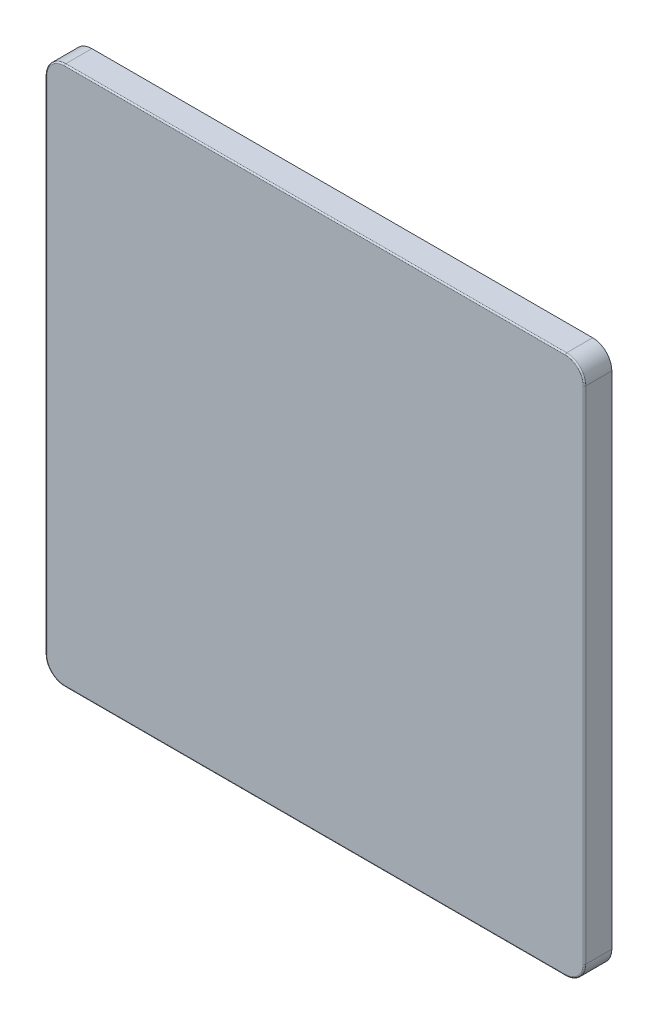
ISO-10303-21;
HEADER;
FILE_DESCRIPTION(('STEP AP214'),'2;1');
FILE_NAME('part.step','',(''),(''),'','','');
FILE_SCHEMA(('AUTOMOTIVE_DESIGN { 1 0 10303 214 1 1 1 1 }'));
ENDSEC;
DATA;
#1=APPLICATION_CONTEXT('core data for automotive mechanical design processes');
#2=APPLICATION_PROTOCOL_DEFINITION('international standard','automotive_design',2000,#1);
#3=PRODUCT_CONTEXT('',#1,'mechanical');
#4=PRODUCT('Part','Part','',(#3));
#5=PRODUCT_RELATED_PRODUCT_CATEGORY('part','',(#4));
#6=PRODUCT_DEFINITION_FORMATION('','',#4);
#7=PRODUCT_DEFINITION_CONTEXT('part definition',#1,'design');
#8=PRODUCT_DEFINITION('design','',#6,#7);
#9=PRODUCT_DEFINITION_SHAPE('','',#8);
#10=(LENGTH_UNIT() NAMED_UNIT(*) SI_UNIT(.MILLI.,.METRE.));
#11=(NAMED_UNIT(*) PLANE_ANGLE_UNIT() SI_UNIT($,.RADIAN.));
#12=(NAMED_UNIT(*) SI_UNIT($,.STERADIAN.) SOLID_ANGLE_UNIT());
#13=UNCERTAINTY_MEASURE_WITH_UNIT(LENGTH_MEASURE(1.E-05),#10,'distance_accuracy_value','');
#14=(GEOMETRIC_REPRESENTATION_CONTEXT(3) GLOBAL_UNCERTAINTY_ASSIGNED_CONTEXT((#13)) GLOBAL_UNIT_ASSIGNED_CONTEXT((#10,
#11,#12)) REPRESENTATION_CONTEXT('',''));
#15=CARTESIAN_POINT('',(0.,0.,0.));
#16=DIRECTION('',(0.,0.,1.));
#17=DIRECTION('',(1.,0.,0.));
#18=AXIS2_PLACEMENT_3D('',#15,#16,#17);
#19=CARTESIAN_POINT('',(89.00000122,55.0000006,4.));
#20=DIRECTION('',(0.,0.,1.));
#21=DIRECTION('',(0.,-1.,0.));
#22=AXIS2_PLACEMENT_3D('',#19,#20,#21);
#23=PLANE('',#22);
#24=CARTESIAN_POINT('',(93.580001420198,50.420000800198,4.));
#25=DIRECTION('',(0.,0.,-1.));
#26=DIRECTION('',(0.999999999999999,4.37107828565012E-08,0.));
#27=AXIS2_PLACEMENT_3D('',#24,#25,#26);
#28=CIRCLE('',#27,0.325000000000006);
#29=CARTESIAN_POINT('',(93.9050014201982,50.420000814404,4.));
#30=VERTEX_POINT('',#29);
#31=CARTESIAN_POINT('',(93.580001434404,50.095000800198,4.));
#32=VERTEX_POINT('',#31);
#33=EDGE_CURVE('E287',#30,#32,#28,.T.);
#34=ORIENTED_EDGE('',*,*,#33,.F.);
#35=DIRECTION('',(-4.371138828674E-08,0.999999999999999,0.));
#36=VECTOR('',#35,1.);
#37=CARTESIAN_POINT('',(93.9050013200992,52.710000814404,4.));
#38=LINE('',#37,#36);
#39=CARTESIAN_POINT('',(93.905001019802,59.5800008144041,4.));
#40=VERTEX_POINT('',#39);
#41=EDGE_CURVE('E268',#40,#30,#38,.F.);
#42=ORIENTED_EDGE('',*,*,#41,.F.);
#43=CARTESIAN_POINT('',(93.580001019802,59.580000800198,4.));
#44=DIRECTION('',(0.,0.,-1.));
#45=DIRECTION('',(-4.37107615060585E-08,0.999999999999999,0.));
#46=AXIS2_PLACEMENT_3D('',#43,#44,#45);
#47=CIRCLE('',#46,0.325000000000006);
#48=CARTESIAN_POINT('',(93.580001005596,59.9050008001982,4.));
#49=VERTEX_POINT('',#48);
#50=EDGE_CURVE('E236',#49,#40,#47,.T.);
#51=ORIENTED_EDGE('',*,*,#50,.F.);
#52=DIRECTION('',(-0.999999999999999,-4.371138834734E-08,0.));
#53=VECTOR('',#52,1.);
#54=CARTESIAN_POINT('',(91.290001005596,59.9050007000992,4.));
#55=LINE('',#54,#53);
#56=CARTESIAN_POINT('',(84.4200010055958,59.905000399802,4.));
#57=VERTEX_POINT('',#56);
#58=EDGE_CURVE('E129',#57,#49,#55,.F.);
#59=ORIENTED_EDGE('',*,*,#58,.F.);
#60=CARTESIAN_POINT('',(84.420001019802,59.580000399802,4.));
#61=DIRECTION('',(0.,0.,-1.));
#62=DIRECTION('',(-0.999999999999999,-4.37114660706702E-08,0.));
#63=AXIS2_PLACEMENT_3D('',#60,#61,#62);
#64=CIRCLE('',#63,0.325000000000006);
#65=CARTESIAN_POINT('',(84.0950010198019,59.5800003855959,4.));
#66=VERTEX_POINT('',#65);
#67=EDGE_CURVE('E123',#66,#57,#64,.T.);
#68=ORIENTED_EDGE('',*,*,#67,.F.);
#69=DIRECTION('',(4.371138822614E-08,-0.999999999999999,0.));
#70=VECTOR('',#69,1.);
#71=CARTESIAN_POINT('',(84.0950011199008,57.290000385596,4.));
#72=LINE('',#71,#70);
#73=CARTESIAN_POINT('',(84.095001420198,50.420000385596,4.));
#74=VERTEX_POINT('',#73);
#75=EDGE_CURVE('E113',#74,#66,#72,.F.);
#76=ORIENTED_EDGE('',*,*,#75,.F.);
#77=CARTESIAN_POINT('',(84.420001420198,50.420000399802,4.));
#78=DIRECTION('',(0.,0.,-1.));
#79=DIRECTION('',(4.37107615060585E-08,-0.999999999999999,0.));
#80=AXIS2_PLACEMENT_3D('',#77,#78,#79);
#81=CIRCLE('',#80,0.325000000000006);
#82=CARTESIAN_POINT('',(84.420001434404,50.0950003998018,4.));
#83=VERTEX_POINT('',#82);
#84=EDGE_CURVE('E140',#83,#74,#81,.T.);
#85=ORIENTED_EDGE('',*,*,#84,.F.);
#86=DIRECTION('',(0.999999999999999,4.371138840794E-08,0.));
#87=VECTOR('',#86,1.);
#88=CARTESIAN_POINT('',(86.710001434404,50.0950004999008,4.));
#89=LINE('',#88,#87);
#90=EDGE_CURVE('E279',#32,#83,#89,.F.);
#91=ORIENTED_EDGE('',*,*,#90,.F.);
#92=EDGE_LOOP('',(#34,#42,#51,#59,#68,#76,#85,#91));
#93=FACE_BOUND('',#92,.T.);
#94=ADVANCED_FACE('F17',(#93),#23,.T.);
#95=CARTESIAN_POINT('',(84.420001019802,59.580000399802,3.975));
#96=DIRECTION('',(0.,0.,1.));
#97=DIRECTION('',(-4.37114020193428E-08,0.999999999999999,0.));
#98=AXIS2_PLACEMENT_3D('',#95,#96,#97);
#99=TOROIDAL_SURFACE('',#98,0.324999999999999,0.025);
#100=CARTESIAN_POINT('',(84.4200010055958,59.9050003998018,3.975));
#101=DIRECTION('',(-0.999999999999999,-4.371138834734E-08,0.));
#102=DIRECTION('',(4.371138834734E-08,-0.999999999999999,0.));
#103=AXIS2_PLACEMENT_3D('',#100,#101,#102);
#104=CIRCLE('',#103,0.025);
#105=CARTESIAN_POINT('',(84.420001004503,59.9300003998018,3.975));
#106=VERTEX_POINT('',#105);
#107=EDGE_CURVE('E234',#106,#57,#104,.F.);
#108=ORIENTED_EDGE('',*,*,#107,.F.);
#109=CARTESIAN_POINT('',(84.420001019802,59.580000399802,3.975));
#110=DIRECTION('',(0.,0.,1.));
#111=DIRECTION('',(0.,-1.,0.));
#112=AXIS2_PLACEMENT_3D('',#109,#110,#111);
#113=CIRCLE('',#112,0.35);
#114=CARTESIAN_POINT('',(84.070001019802,59.5800003845031,3.975));
#115=VERTEX_POINT('',#114);
#116=EDGE_CURVE('E138',#115,#106,#113,.F.);
#117=ORIENTED_EDGE('',*,*,#116,.F.);
#118=CARTESIAN_POINT('',(84.0950010198019,59.580000385596,3.975));
#119=DIRECTION('',(4.371138822614E-08,-0.999999999999999,0.));
#120=DIRECTION('',(0.999999999999999,4.371138822614E-08,0.));
#121=AXIS2_PLACEMENT_3D('',#118,#119,#120);
#122=CIRCLE('',#121,0.025);
#123=EDGE_CURVE('E118',#66,#115,#122,.T.);
#124=ORIENTED_EDGE('',*,*,#123,.F.);
#125=ORIENTED_EDGE('',*,*,#67,.T.);
#126=EDGE_LOOP('',(#108,#117,#124,#125));
#127=FACE_BOUND('',#126,.T.);
#128=ADVANCED_FACE('F137',(#127),#99,.T.);
#129=CARTESIAN_POINT('',(84.095001119901,57.290000385596,3.975));
#130=DIRECTION('',(4.371138822614E-08,-0.999999999999999,0.));
#131=DIRECTION('',(0.999999999999999,4.371138822614E-08,0.));
#132=AXIS2_PLACEMENT_3D('',#129,#130,#131);
#133=CYLINDRICAL_SURFACE('',#132,0.025);
#134=ORIENTED_EDGE('',*,*,#123,.T.);
#135=DIRECTION('',(4.371138822614E-08,-0.999999999999999,0.));
#136=VECTOR('',#135,1.);
#137=CARTESIAN_POINT('',(84.070001019802,59.580000384503,3.975));
#138=LINE('',#137,#136);
#139=CARTESIAN_POINT('',(84.0700014201981,50.4200003845031,3.975));
#140=VERTEX_POINT('',#139);
#141=EDGE_CURVE('E221',#140,#115,#138,.F.);
#142=ORIENTED_EDGE('',*,*,#141,.F.);
#143=CARTESIAN_POINT('',(84.095001420198,50.420000385596,3.975));
#144=DIRECTION('',(4.37107691651491E-08,-0.999999999999999,0.));
#145=DIRECTION('',(-0.999999999999999,-4.37105266924432E-08,0.));
#146=AXIS2_PLACEMENT_3D('',#143,#144,#145);
#147=CIRCLE('',#146,0.025);
#148=EDGE_CURVE('E120',#74,#140,#147,.T.);
#149=ORIENTED_EDGE('',*,*,#148,.F.);
#150=ORIENTED_EDGE('',*,*,#75,.T.);
#151=EDGE_LOOP('',(#134,#142,#149,#150));
#152=FACE_BOUND('',#151,.T.);
#153=ADVANCED_FACE('F115',(#152),#133,.T.);
#154=CARTESIAN_POINT('',(84.420001420198,50.420000399802,3.975));
#155=DIRECTION('',(0.,0.,1.));
#156=DIRECTION('',(-4.37114020193428E-08,0.999999999999999,0.));
#157=AXIS2_PLACEMENT_3D('',#154,#155,#156);
#158=TOROIDAL_SURFACE('',#157,0.324999999999999,0.025);
#159=ORIENTED_EDGE('',*,*,#148,.T.);
#160=CARTESIAN_POINT('',(84.420001420198,50.420000399802,3.975));
#161=DIRECTION('',(0.,0.,1.));
#162=DIRECTION('',(0.,-1.,0.));
#163=AXIS2_PLACEMENT_3D('',#160,#161,#162);
#164=CIRCLE('',#163,0.35);
#165=CARTESIAN_POINT('',(84.420001435497,50.070000399802,3.975));
#166=VERTEX_POINT('',#165);
#167=EDGE_CURVE('E216',#166,#140,#164,.F.);
#168=ORIENTED_EDGE('',*,*,#167,.F.);
#169=CARTESIAN_POINT('',(84.420001434404,50.0950003998019,3.975));
#170=DIRECTION('',(0.999999999999999,4.371138840794E-08,0.));
#171=DIRECTION('',(-4.371138840794E-08,0.999999999999999,0.));
#172=AXIS2_PLACEMENT_3D('',#169,#170,#171);
#173=CIRCLE('',#172,0.025);
#174=EDGE_CURVE('E281',#83,#166,#173,.T.);
#175=ORIENTED_EDGE('',*,*,#174,.F.);
#176=ORIENTED_EDGE('',*,*,#84,.T.);
#177=EDGE_LOOP('',(#159,#168,#175,#176));
#178=FACE_BOUND('',#177,.T.);
#179=ADVANCED_FACE('F322',(#178),#158,.T.);
#180=CARTESIAN_POINT('',(86.710001434404,50.095000499901,3.975));
#181=DIRECTION('',(0.999999999999999,4.371138840794E-08,0.));
#182=DIRECTION('',(-4.371138840794E-08,0.999999999999999,0.));
#183=AXIS2_PLACEMENT_3D('',#180,#181,#182);
#184=CYLINDRICAL_SURFACE('',#183,0.025);
#185=ORIENTED_EDGE('',*,*,#174,.T.);
#186=DIRECTION('',(0.999999999999999,4.371138840794E-08,0.));
#187=VECTOR('',#186,1.);
#188=CARTESIAN_POINT('',(84.420001435497,50.070000399802,3.975));
#189=LINE('',#188,#187);
#190=CARTESIAN_POINT('',(93.5800014240227,50.0700008001981,3.975));
#191=VERTEX_POINT('',#190);
#192=EDGE_CURVE('E211',#191,#166,#189,.F.);
#193=ORIENTED_EDGE('',*,*,#192,.F.);
#194=CARTESIAN_POINT('',(93.580001434404,50.095000800198,3.975));
#195=DIRECTION('',(0.999999999999999,4.37107477876347E-08,0.));
#196=DIRECTION('',(4.37105053149288E-08,-0.999999999999999,0.));
#197=AXIS2_PLACEMENT_3D('',#194,#195,#196);
#198=CIRCLE('',#197,0.025);
#199=EDGE_CURVE('E276',#32,#191,#198,.T.);
#200=ORIENTED_EDGE('',*,*,#199,.F.);
#201=ORIENTED_EDGE('',*,*,#90,.T.);
#202=EDGE_LOOP('',(#185,#193,#200,#201));
#203=FACE_BOUND('',#202,.T.);
#204=ADVANCED_FACE('F302',(#203),#184,.T.);
#205=CARTESIAN_POINT('',(93.580001420198,50.420000800198,3.975));
#206=DIRECTION('',(0.,0.,1.));
#207=DIRECTION('',(-4.37114020193428E-08,0.999999999999999,0.));
#208=AXIS2_PLACEMENT_3D('',#205,#206,#207);
#209=TOROIDAL_SURFACE('',#208,0.324999999999999,0.025);
#210=ORIENTED_EDGE('',*,*,#199,.T.);
#211=CARTESIAN_POINT('',(93.580001420198,50.420000800198,3.975));
#212=DIRECTION('',(0.,0.,1.));
#213=DIRECTION('',(0.,-1.,0.));
#214=AXIS2_PLACEMENT_3D('',#211,#212,#213);
#215=CIRCLE('',#214,0.35);
#216=CARTESIAN_POINT('',(93.930001420198,50.4200008154969,3.975));
#217=VERTEX_POINT('',#216);
#218=EDGE_CURVE('E206',#217,#191,#215,.F.);
#219=ORIENTED_EDGE('',*,*,#218,.F.);
#220=CARTESIAN_POINT('',(93.9050014201981,50.420000814404,3.975));
#221=DIRECTION('',(-4.371138828674E-08,0.999999999999999,0.));
#222=DIRECTION('',(-0.999999999999999,-4.371138828674E-08,0.));
#223=AXIS2_PLACEMENT_3D('',#220,#221,#222);
#224=CIRCLE('',#223,0.025);
#225=EDGE_CURVE('E275',#30,#217,#224,.T.);
#226=ORIENTED_EDGE('',*,*,#225,.F.);
#227=ORIENTED_EDGE('',*,*,#33,.T.);
#228=EDGE_LOOP('',(#210,#219,#226,#227));
#229=FACE_BOUND('',#228,.T.);
#230=ADVANCED_FACE('F292',(#229),#209,.T.);
#231=CARTESIAN_POINT('',(93.905001320099,52.710000814404,3.975));
#232=DIRECTION('',(-4.371138828674E-08,0.999999999999999,0.));
#233=DIRECTION('',(-0.999999999999999,-4.371138828674E-08,0.));
#234=AXIS2_PLACEMENT_3D('',#231,#232,#233);
#235=CYLINDRICAL_SURFACE('',#234,0.025);
#236=ORIENTED_EDGE('',*,*,#225,.T.);
#237=DIRECTION('',(-4.371138828674E-08,0.999999999999999,0.));
#238=VECTOR('',#237,1.);
#239=CARTESIAN_POINT('',(93.930001420198,50.420000815497,3.975));
#240=LINE('',#239,#238);
#241=CARTESIAN_POINT('',(93.9300010198019,59.5800008154969,3.975));
#242=VERTEX_POINT('',#241);
#243=EDGE_CURVE('E201',#242,#217,#240,.F.);
#244=ORIENTED_EDGE('',*,*,#243,.F.);
#245=CARTESIAN_POINT('',(93.905001019802,59.580000814404,3.975));
#246=DIRECTION('',(-4.37107690426844E-08,0.999999999999999,0.));
#247=DIRECTION('',(0.999999999999999,4.37105265699786E-08,0.));
#248=AXIS2_PLACEMENT_3D('',#245,#246,#247);
#249=CIRCLE('',#248,0.025);
#250=EDGE_CURVE('E248',#40,#242,#249,.T.);
#251=ORIENTED_EDGE('',*,*,#250,.F.);
#252=ORIENTED_EDGE('',*,*,#41,.T.);
#253=EDGE_LOOP('',(#236,#244,#251,#252));
#254=FACE_BOUND('',#253,.T.);
#255=ADVANCED_FACE('F257',(#254),#235,.T.);
#256=CARTESIAN_POINT('',(93.580001019802,59.580000800198,3.975));
#257=DIRECTION('',(0.,0.,1.));
#258=DIRECTION('',(-4.37114020193428E-08,0.999999999999999,0.));
#259=AXIS2_PLACEMENT_3D('',#256,#257,#258);
#260=TOROIDAL_SURFACE('',#259,0.324999999999999,0.025);
#261=CARTESIAN_POINT('',(93.580001005596,59.9050008001981,3.975));
#262=DIRECTION('',(-0.999999999999999,-4.371138834734E-08,0.));
#263=DIRECTION('',(4.371138834734E-08,-0.999999999999999,0.));
#264=AXIS2_PLACEMENT_3D('',#261,#262,#263);
#265=CIRCLE('',#264,0.025);
#266=CARTESIAN_POINT('',(93.5800010045031,59.930000800198,3.975));
#267=VERTEX_POINT('',#266);
#268=EDGE_CURVE('E67',#49,#267,#265,.T.);
#269=ORIENTED_EDGE('',*,*,#268,.F.);
#270=ORIENTED_EDGE('',*,*,#50,.T.);
#271=ORIENTED_EDGE('',*,*,#250,.T.);
#272=CARTESIAN_POINT('',(93.580001019802,59.580000800198,3.975));
#273=DIRECTION('',(0.,0.,1.));
#274=DIRECTION('',(0.,-1.,0.));
#275=AXIS2_PLACEMENT_3D('',#272,#273,#274);
#276=CIRCLE('',#275,0.35);
#277=EDGE_CURVE('E196',#267,#242,#276,.F.);
#278=ORIENTED_EDGE('',*,*,#277,.F.);
#279=EDGE_LOOP('',(#269,#270,#271,#278));
#280=FACE_BOUND('',#279,.T.);
#281=ADVANCED_FACE('F251',(#280),#260,.T.);
#282=CARTESIAN_POINT('',(91.290001005596,59.905000700099,3.975));
#283=DIRECTION('',(-0.999999999999999,-4.371138834734E-08,0.));
#284=DIRECTION('',(4.371138834734E-08,-0.999999999999999,0.));
#285=AXIS2_PLACEMENT_3D('',#282,#283,#284);
#286=CYLINDRICAL_SURFACE('',#285,0.025);
#287=ORIENTED_EDGE('',*,*,#268,.T.);
#288=DIRECTION('',(-0.999999999999999,-4.371138834734E-08,0.));
#289=VECTOR('',#288,1.);
#290=CARTESIAN_POINT('',(93.580001004503,59.930000800198,3.975));
#291=LINE('',#290,#289);
#292=EDGE_CURVE('E187',#106,#267,#291,.F.);
#293=ORIENTED_EDGE('',*,*,#292,.F.);
#294=ORIENTED_EDGE('',*,*,#107,.T.);
#295=ORIENTED_EDGE('',*,*,#58,.T.);
#296=EDGE_LOOP('',(#287,#293,#294,#295));
#297=FACE_BOUND('',#296,.T.);
#298=ADVANCED_FACE('F256',(#297),#286,.T.);
#299=CARTESIAN_POINT('',(84.420001019802,59.580000399802,3.5));
#300=DIRECTION('',(0.,0.,1.));
#301=DIRECTION('',(0.,-1.,0.));
#302=AXIS2_PLACEMENT_3D('',#299,#300,#301);
#303=CYLINDRICAL_SURFACE('',#302,0.35);
#304=CARTESIAN_POINT('',(84.420001019802,59.580000399802,3.5));
#305=DIRECTION('',(0.,0.,1.));
#306=DIRECTION('',(0.,-1.,0.));
#307=AXIS2_PLACEMENT_3D('',#304,#305,#306);
#308=CIRCLE('',#307,0.35);
#309=CARTESIAN_POINT('',(84.4200010121525,59.9300005999998,3.5));
#310=VERTEX_POINT('',#309);
#311=CARTESIAN_POINT('',(84.070001019802,59.5800003921525,3.5));
#312=VERTEX_POINT('',#311);
#313=EDGE_CURVE('E21',#310,#312,#308,.T.);
#314=ORIENTED_EDGE('',*,*,#313,.T.);
#315=DIRECTION('',(0.,0.,1.));
#316=VECTOR('',#315,1.);
#317=CARTESIAN_POINT('',(84.070001019802,59.580000384503,3.5));
#318=LINE('',#317,#316);
#319=EDGE_CURVE('E219',#115,#312,#318,.F.);
#320=ORIENTED_EDGE('',*,*,#319,.F.);
#321=ORIENTED_EDGE('',*,*,#116,.T.);
#322=DIRECTION('',(0.,0.,1.));
#323=VECTOR('',#322,1.);
#324=CARTESIAN_POINT('',(84.420001004503,59.9300003998017,3.5));
#325=LINE('',#324,#323);
#326=EDGE_CURVE('E183',#310,#106,#325,.T.);
#327=ORIENTED_EDGE('',*,*,#326,.F.);
#328=EDGE_LOOP('',(#314,#320,#321,#327));
#329=FACE_BOUND('',#328,.T.);
#330=ADVANCED_FACE('F386',(#329),#303,.T.);
#331=CARTESIAN_POINT('',(84.070001019802,59.580000384503,3.5));
#332=DIRECTION('',(-0.999999999999999,-4.371138822614E-08,0.));
#333=DIRECTION('',(4.371138822614E-08,-0.999999999999999,0.));
#334=AXIS2_PLACEMENT_3D('',#331,#332,#333);
#335=PLANE('',#334);
#336=DIRECTION('',(0.,-1.,0.));
#337=VECTOR('',#336,1.);
#338=CARTESIAN_POINT('',(84.070001019802,55.0000006,3.5));
#339=LINE('',#338,#337);
#340=CARTESIAN_POINT('',(84.07000122,50.4200003921525,3.5));
#341=VERTEX_POINT('',#340);
#342=EDGE_CURVE('E173',#312,#341,#339,.T.);
#343=ORIENTED_EDGE('',*,*,#342,.T.);
#344=DIRECTION('',(0.,0.,1.));
#345=VECTOR('',#344,1.);
#346=CARTESIAN_POINT('',(84.070001420198,50.420000384503,3.5));
#347=LINE('',#346,#345);
#348=EDGE_CURVE('E214',#140,#341,#347,.F.);
#349=ORIENTED_EDGE('',*,*,#348,.F.);
#350=ORIENTED_EDGE('',*,*,#141,.T.);
#351=ORIENTED_EDGE('',*,*,#319,.T.);
#352=EDGE_LOOP('',(#343,#349,#350,#351));
#353=FACE_BOUND('',#352,.T.);
#354=ADVANCED_FACE('F377',(#353),#335,.T.);
#355=CARTESIAN_POINT('',(84.420001420198,50.420000399802,3.5));
#356=DIRECTION('',(0.,0.,1.));
#357=DIRECTION('',(0.,-1.,0.));
#358=AXIS2_PLACEMENT_3D('',#355,#356,#357);
#359=CYLINDRICAL_SURFACE('',#358,0.35);
#360=CARTESIAN_POINT('',(84.420001420198,50.420000399802,3.5));
#361=DIRECTION('',(0.,0.,1.));
#362=DIRECTION('',(0.,-1.,0.));
#363=AXIS2_PLACEMENT_3D('',#360,#361,#362);
#364=CIRCLE('',#363,0.35);
#365=CARTESIAN_POINT('',(84.4200014278475,50.070000399802,3.5));
#366=VERTEX_POINT('',#365);
#367=EDGE_CURVE('E171',#341,#366,#364,.T.);
#368=ORIENTED_EDGE('',*,*,#367,.T.);
#369=DIRECTION('',(0.,0.,1.));
#370=VECTOR('',#369,1.);
#371=CARTESIAN_POINT('',(84.420001435497,50.070000399802,3.5));
#372=LINE('',#371,#370);
#373=EDGE_CURVE('E209',#166,#366,#372,.F.);
#374=ORIENTED_EDGE('',*,*,#373,.F.);
#375=ORIENTED_EDGE('',*,*,#167,.T.);
#376=ORIENTED_EDGE('',*,*,#348,.T.);
#377=EDGE_LOOP('',(#368,#374,#375,#376));
#378=FACE_BOUND('',#377,.T.);
#379=ADVANCED_FACE('F375',(#378),#359,.T.);
#380=CARTESIAN_POINT('',(84.420001435497,50.070000399802,3.5));
#381=DIRECTION('',(4.371138840794E-08,-0.999999999999999,0.));
#382=DIRECTION('',(0.999999999999999,4.371138840794E-08,0.));
#383=AXIS2_PLACEMENT_3D('',#380,#381,#382);
#384=PLANE('',#383);
#385=DIRECTION('',(1.,0.,0.));
#386=VECTOR('',#385,1.);
#387=CARTESIAN_POINT('',(89.00000122,50.070000399802,3.5));
#388=LINE('',#387,#386);
#389=CARTESIAN_POINT('',(93.580001420198,50.0700006,3.5));
#390=VERTEX_POINT('',#389);
#391=EDGE_CURVE('E170',#366,#390,#388,.T.);
#392=ORIENTED_EDGE('',*,*,#391,.T.);
#393=DIRECTION('',(0.,0.,1.));
#394=VECTOR('',#393,1.);
#395=CARTESIAN_POINT('',(93.580001420198,50.070000800198,3.5));
#396=LINE('',#395,#394);
#397=EDGE_CURVE('E204',#191,#390,#396,.F.);
#398=ORIENTED_EDGE('',*,*,#397,.F.);
#399=ORIENTED_EDGE('',*,*,#192,.T.);
#400=ORIENTED_EDGE('',*,*,#373,.T.);
#401=EDGE_LOOP('',(#392,#398,#399,#400));
#402=FACE_BOUND('',#401,.T.);
#403=ADVANCED_FACE('F372',(#402),#384,.T.);
#404=CARTESIAN_POINT('',(93.580001420198,50.420000800198,3.5));
#405=DIRECTION('',(0.,0.,1.));
#406=DIRECTION('',(0.,-1.,0.));
#407=AXIS2_PLACEMENT_3D('',#404,#405,#406);
#408=CYLINDRICAL_SURFACE('',#407,0.35);
#409=CARTESIAN_POINT('',(93.580001420198,50.420000800198,3.5));
#410=DIRECTION('',(0.,0.,1.));
#411=DIRECTION('',(0.,-1.,0.));
#412=AXIS2_PLACEMENT_3D('',#409,#410,#411);
#413=CIRCLE('',#412,0.35);
#414=CARTESIAN_POINT('',(93.930001420198,50.4200008078475,3.5));
#415=VERTEX_POINT('',#414);
#416=EDGE_CURVE('E168',#390,#415,#413,.T.);
#417=ORIENTED_EDGE('',*,*,#416,.T.);
#418=DIRECTION('',(0.,0.,1.));
#419=VECTOR('',#418,1.);
#420=CARTESIAN_POINT('',(93.930001420198,50.420000815497,3.5));
#421=LINE('',#420,#419);
#422=EDGE_CURVE('E199',#217,#415,#421,.F.);
#423=ORIENTED_EDGE('',*,*,#422,.F.);
#424=ORIENTED_EDGE('',*,*,#218,.T.);
#425=ORIENTED_EDGE('',*,*,#397,.T.);
#426=EDGE_LOOP('',(#417,#423,#424,#425));
#427=FACE_BOUND('',#426,.T.);
#428=ADVANCED_FACE('F384',(#427),#408,.T.);
#429=CARTESIAN_POINT('',(93.930001420198,50.420000815497,3.5));
#430=DIRECTION('',(0.999999999999999,4.371138828674E-08,0.));
#431=DIRECTION('',(-4.371138828674E-08,0.999999999999999,0.));
#432=AXIS2_PLACEMENT_3D('',#429,#430,#431);
#433=PLANE('',#432);
#434=DIRECTION('',(0.,-1.,0.));
#435=VECTOR('',#434,1.);
#436=CARTESIAN_POINT('',(93.930001420198,55.0000006,3.5));
#437=LINE('',#436,#435);
#438=CARTESIAN_POINT('',(93.93000122,59.5800008078475,3.5));
#439=VERTEX_POINT('',#438);
#440=EDGE_CURVE('E167',#415,#439,#437,.F.);
#441=ORIENTED_EDGE('',*,*,#440,.T.);
#442=DIRECTION('',(0.,0.,1.));
#443=VECTOR('',#442,1.);
#444=CARTESIAN_POINT('',(93.930001019802,59.580000815497,3.5));
#445=LINE('',#444,#443);
#446=EDGE_CURVE('E194',#242,#439,#445,.F.);
#447=ORIENTED_EDGE('',*,*,#446,.F.);
#448=ORIENTED_EDGE('',*,*,#243,.T.);
#449=ORIENTED_EDGE('',*,*,#422,.T.);
#450=EDGE_LOOP('',(#441,#447,#448,#449));
#451=FACE_BOUND('',#450,.T.);
#452=ADVANCED_FACE('F401',(#451),#433,.T.);
#453=CARTESIAN_POINT('',(93.580001019802,59.580000800198,3.5));
#454=DIRECTION('',(0.,0.,1.));
#455=DIRECTION('',(0.,-1.,0.));
#456=AXIS2_PLACEMENT_3D('',#453,#454,#455);
#457=CYLINDRICAL_SURFACE('',#456,0.35);
#458=CARTESIAN_POINT('',(93.580001019802,59.580000800198,3.5));
#459=DIRECTION('',(0.,0.,1.));
#460=DIRECTION('',(0.,-1.,0.));
#461=AXIS2_PLACEMENT_3D('',#458,#459,#460);
#462=CIRCLE('',#461,0.35);
#463=CARTESIAN_POINT('',(93.5800010121525,59.930000800198,3.5));
#464=VERTEX_POINT('',#463);
#465=EDGE_CURVE('E27',#439,#464,#462,.T.);
#466=ORIENTED_EDGE('',*,*,#465,.T.);
#467=DIRECTION('',(0.,0.,1.));
#468=VECTOR('',#467,1.);
#469=CARTESIAN_POINT('',(93.580001004503,59.930000800198,3.5));
#470=LINE('',#469,#468);
#471=EDGE_CURVE('E35',#267,#464,#470,.F.);
#472=ORIENTED_EDGE('',*,*,#471,.F.);
#473=ORIENTED_EDGE('',*,*,#277,.T.);
#474=ORIENTED_EDGE('',*,*,#446,.T.);
#475=EDGE_LOOP('',(#466,#472,#473,#474));
#476=FACE_BOUND('',#475,.T.);
#477=ADVANCED_FACE('F395',(#476),#457,.T.);
#478=CARTESIAN_POINT('',(93.580001004503,59.930000800198,3.5));
#479=DIRECTION('',(-4.371138834734E-08,0.999999999999999,0.));
#480=DIRECTION('',(-0.999999999999999,-4.371138834734E-08,0.));
#481=AXIS2_PLACEMENT_3D('',#478,#479,#480);
#482=PLANE('',#481);
#483=DIRECTION('',(1.,0.,0.));
#484=VECTOR('',#483,1.);
#485=CARTESIAN_POINT('',(89.00000122,59.930000800198,3.5));
#486=LINE('',#485,#484);
#487=EDGE_CURVE('E11',#464,#310,#486,.F.);
#488=ORIENTED_EDGE('',*,*,#487,.T.);
#489=ORIENTED_EDGE('',*,*,#326,.T.);
#490=ORIENTED_EDGE('',*,*,#292,.T.);
#491=ORIENTED_EDGE('',*,*,#471,.T.);
#492=EDGE_LOOP('',(#488,#489,#490,#491));
#493=FACE_BOUND('',#492,.T.);
#494=ADVANCED_FACE('F390',(#493),#482,.T.);
#495=CARTESIAN_POINT('',(89.00000122,55.0000006,3.5));
#496=DIRECTION('',(0.,0.,1.));
#497=DIRECTION('',(0.,-1.,0.));
#498=AXIS2_PLACEMENT_3D('',#495,#496,#497);
#499=PLANE('',#498);
#500=ORIENTED_EDGE('',*,*,#465,.F.);
#501=ORIENTED_EDGE('',*,*,#440,.F.);
#502=ORIENTED_EDGE('',*,*,#416,.F.);
#503=ORIENTED_EDGE('',*,*,#391,.F.);
#504=ORIENTED_EDGE('',*,*,#367,.F.);
#505=ORIENTED_EDGE('',*,*,#342,.F.);
#506=ORIENTED_EDGE('',*,*,#313,.F.);
#507=ORIENTED_EDGE('',*,*,#487,.F.);
#508=EDGE_LOOP('',(#500,#501,#502,#503,#504,#505,#506,#507));
#509=FACE_BOUND('',#508,.T.);
#510=ADVANCED_FACE('F388',(#509),#499,.F.);
#511=CLOSED_SHELL('',(#94,#128,#153,#179,#204,#230,#255,#281,#298,#330,#354,#379,#403,#428,#452,
#477,#494,#510));
#512=MANIFOLD_SOLID_BREP('B1',#511);
#513=ADVANCED_BREP_SHAPE_REPRESENTATION('',(#18,#512),#14);
#514=SHAPE_DEFINITION_REPRESENTATION(#9,#513);
ENDSEC;
END-ISO-10303-21;
